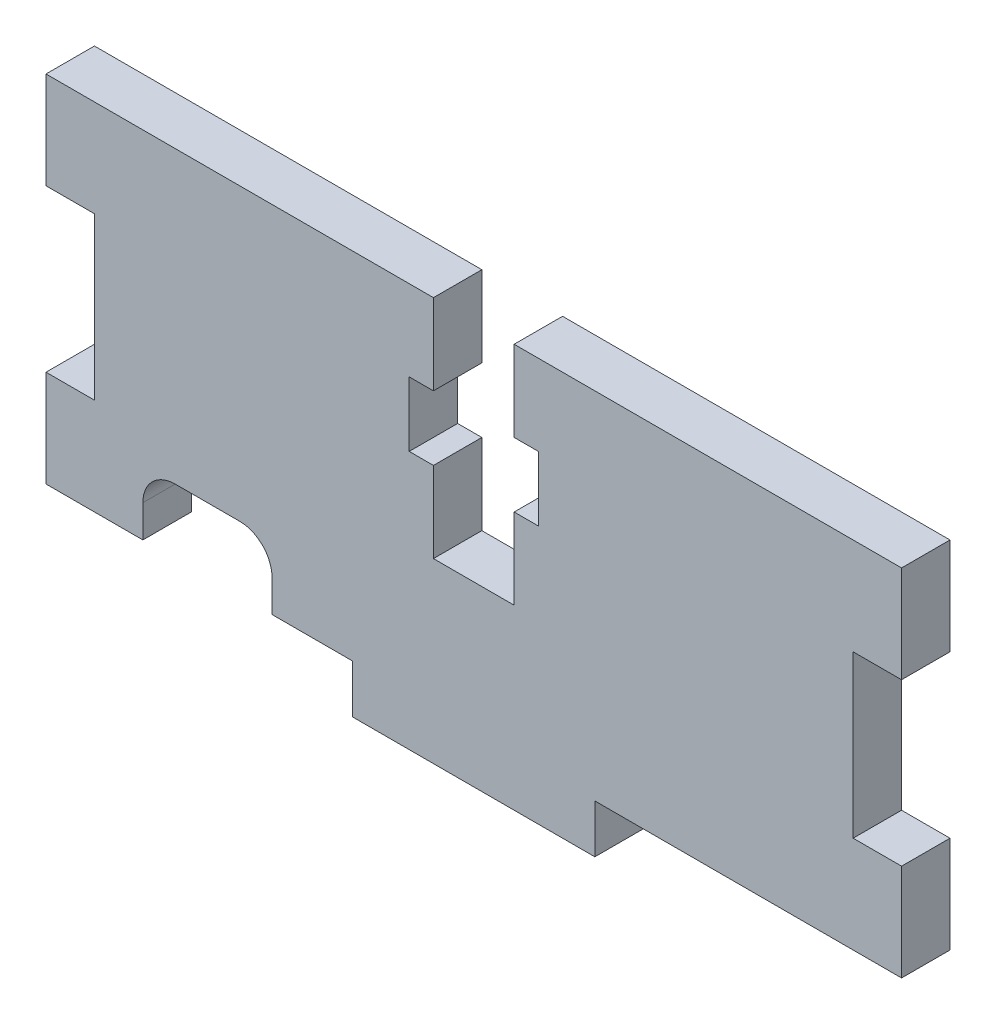
ISO-10303-21;
HEADER;
FILE_DESCRIPTION(('STEP AP214'),'2;1');
FILE_NAME('part.step','',(''),(''),'','','');
FILE_SCHEMA(('AUTOMOTIVE_DESIGN { 1 0 10303 214 1 1 1 1 }'));
ENDSEC;
DATA;
#1=APPLICATION_CONTEXT('core data for automotive mechanical design processes');
#2=APPLICATION_PROTOCOL_DEFINITION('international standard','automotive_design',2000,#1);
#3=PRODUCT_CONTEXT('',#1,'mechanical');
#4=PRODUCT('Part','Part','',(#3));
#5=PRODUCT_RELATED_PRODUCT_CATEGORY('part','',(#4));
#6=PRODUCT_DEFINITION_FORMATION('','',#4);
#7=PRODUCT_DEFINITION_CONTEXT('part definition',#1,'design');
#8=PRODUCT_DEFINITION('design','',#6,#7);
#9=PRODUCT_DEFINITION_SHAPE('','',#8);
#10=(LENGTH_UNIT() NAMED_UNIT(*) SI_UNIT(.MILLI.,.METRE.));
#11=(NAMED_UNIT(*) PLANE_ANGLE_UNIT() SI_UNIT($,.RADIAN.));
#12=(NAMED_UNIT(*) SI_UNIT($,.STERADIAN.) SOLID_ANGLE_UNIT());
#13=UNCERTAINTY_MEASURE_WITH_UNIT(LENGTH_MEASURE(1.E-05),#10,'distance_accuracy_value','');
#14=(GEOMETRIC_REPRESENTATION_CONTEXT(3) GLOBAL_UNCERTAINTY_ASSIGNED_CONTEXT((#13)) GLOBAL_UNIT_ASSIGNED_CONTEXT((#10,
#11,#12)) REPRESENTATION_CONTEXT('',''));
#15=CARTESIAN_POINT('',(0.,0.,0.));
#16=DIRECTION('',(0.,0.,1.));
#17=DIRECTION('',(1.,0.,0.));
#18=AXIS2_PLACEMENT_3D('',#15,#16,#17);
#19=CARTESIAN_POINT('',(-54.,11.,1.5));
#20=DIRECTION('',(0.,1.,0.));
#21=DIRECTION('',(-1.,0.,0.));
#22=AXIS2_PLACEMENT_3D('',#19,#20,#21);
#23=PLANE('',#22);
#24=DIRECTION('',(0.,0.,1.));
#25=VECTOR('',#24,1.);
#26=CARTESIAN_POINT('',(30.,11.,-1.5));
#27=LINE('',#26,#25);
#28=CARTESIAN_POINT('',(30.,11.,-1.5));
#29=VERTEX_POINT('',#28);
#30=CARTESIAN_POINT('',(30.,11.,1.5));
#31=VERTEX_POINT('',#30);
#32=EDGE_CURVE('E431',#29,#31,#27,.T.);
#33=ORIENTED_EDGE('',*,*,#32,.T.);
#34=DIRECTION('',(1.,0.,0.));
#35=VECTOR('',#34,1.);
#36=CARTESIAN_POINT('',(-54.,11.,1.5));
#37=LINE('',#36,#35);
#38=CARTESIAN_POINT('',(54.,11.,1.5));
#39=VERTEX_POINT('',#38);
#40=EDGE_CURVE('E396',#31,#39,#37,.T.);
#41=ORIENTED_EDGE('',*,*,#40,.T.);
#42=DIRECTION('',(0.,0.,-1.));
#43=VECTOR('',#42,1.);
#44=CARTESIAN_POINT('',(54.,11.,1.5));
#45=LINE('',#44,#43);
#46=CARTESIAN_POINT('',(54.,11.,-1.5));
#47=VERTEX_POINT('',#46);
#48=EDGE_CURVE('E289',#39,#47,#45,.T.);
#49=ORIENTED_EDGE('',*,*,#48,.T.);
#50=DIRECTION('',(1.,0.,0.));
#51=VECTOR('',#50,1.);
#52=CARTESIAN_POINT('',(-54.,11.,-1.5));
#53=LINE('',#52,#51);
#54=EDGE_CURVE('E281',#29,#47,#53,.T.);
#55=ORIENTED_EDGE('',*,*,#54,.F.);
#56=EDGE_LOOP('',(#33,#41,#49,#55));
#57=FACE_BOUND('',#56,.T.);
#58=ADVANCED_FACE('F33',(#57),#23,.T.);
#59=CARTESIAN_POINT('',(-20.,-11.,1.5));
#60=DIRECTION('',(0.,1.,0.));
#61=DIRECTION('',(-1.,0.,0.));
#62=AXIS2_PLACEMENT_3D('',#59,#60,#61);
#63=PLANE('',#62);
#64=DIRECTION('',(1.,0.,0.));
#65=VECTOR('',#64,1.);
#66=CARTESIAN_POINT('',(-20.,-11.,1.5));
#67=LINE('',#66,#65);
#68=CARTESIAN_POINT('',(15.,-11.,1.5));
#69=VERTEX_POINT('',#68);
#70=CARTESIAN_POINT('',(20.,-11.,1.5));
#71=VERTEX_POINT('',#70);
#72=EDGE_CURVE('E280',#69,#71,#67,.T.);
#73=ORIENTED_EDGE('',*,*,#72,.F.);
#74=DIRECTION('',(0.,0.,-1.));
#75=VECTOR('',#74,1.);
#76=CARTESIAN_POINT('',(15.,-11.,1.5));
#77=LINE('',#76,#75);
#78=CARTESIAN_POINT('',(15.,-11.,-1.5));
#79=VERTEX_POINT('',#78);
#80=EDGE_CURVE('E406',#69,#79,#77,.T.);
#81=ORIENTED_EDGE('',*,*,#80,.T.);
#82=DIRECTION('',(1.,0.,0.));
#83=VECTOR('',#82,1.);
#84=CARTESIAN_POINT('',(-20.,-11.,-1.5));
#85=LINE('',#84,#83);
#86=CARTESIAN_POINT('',(20.,-11.,-1.5));
#87=VERTEX_POINT('',#86);
#88=EDGE_CURVE('E377',#79,#87,#85,.T.);
#89=ORIENTED_EDGE('',*,*,#88,.T.);
#90=DIRECTION('',(0.,0.,-1.));
#91=VECTOR('',#90,1.);
#92=CARTESIAN_POINT('',(20.,-11.,1.5));
#93=LINE('',#92,#91);
#94=EDGE_CURVE('E11',#71,#87,#93,.T.);
#95=ORIENTED_EDGE('',*,*,#94,.F.);
#96=EDGE_LOOP('',(#73,#81,#89,#95));
#97=FACE_BOUND('',#96,.T.);
#98=ADVANCED_FACE('F405',(#97),#63,.F.);
#99=CARTESIAN_POINT('',(54.,11.,1.5));
#100=DIRECTION('',(1.,0.,0.));
#101=DIRECTION('',(0.,0.,-1.));
#102=AXIS2_PLACEMENT_3D('',#99,#100,#101);
#103=PLANE('',#102);
#104=DIRECTION('',(0.,0.,1.));
#105=VECTOR('',#104,1.);
#106=CARTESIAN_POINT('',(54.,5.,-1.5));
#107=LINE('',#106,#105);
#108=CARTESIAN_POINT('',(54.,5.,-1.5));
#109=VERTEX_POINT('',#108);
#110=CARTESIAN_POINT('',(54.,5.,1.5));
#111=VERTEX_POINT('',#110);
#112=EDGE_CURVE('E342',#109,#111,#107,.T.);
#113=ORIENTED_EDGE('',*,*,#112,.F.);
#114=DIRECTION('',(0.,-1.,0.));
#115=VECTOR('',#114,1.);
#116=CARTESIAN_POINT('',(54.,11.,-1.5));
#117=LINE('',#116,#115);
#118=EDGE_CURVE('E285',#47,#109,#117,.T.);
#119=ORIENTED_EDGE('',*,*,#118,.F.);
#120=ORIENTED_EDGE('',*,*,#48,.F.);
#121=DIRECTION('',(0.,-1.,0.));
#122=VECTOR('',#121,1.);
#123=CARTESIAN_POINT('',(54.,11.,1.5));
#124=LINE('',#123,#122);
#125=EDGE_CURVE('E343',#39,#111,#124,.T.);
#126=ORIENTED_EDGE('',*,*,#125,.T.);
#127=EDGE_LOOP('',(#113,#119,#120,#126));
#128=FACE_BOUND('',#127,.T.);
#129=ADVANCED_FACE('F339',(#128),#103,.T.);
#130=CARTESIAN_POINT('',(1.00000000000002,-11.,-1.5));
#131=VERTEX_POINT('',#130);
#132=CARTESIAN_POINT('',(7.,-11.,-1.5));
#133=VERTEX_POINT('',#132);
#134=EDGE_CURVE('E320',#131,#133,#85,.T.);
#135=ORIENTED_EDGE('',*,*,#134,.T.);
#136=DIRECTION('',(0.,0.,-1.));
#137=VECTOR('',#136,1.);
#138=CARTESIAN_POINT('',(7.,-11.,1.5));
#139=LINE('',#138,#137);
#140=CARTESIAN_POINT('',(7.,-11.,1.5));
#141=VERTEX_POINT('',#140);
#142=EDGE_CURVE('E56',#141,#133,#139,.T.);
#143=ORIENTED_EDGE('',*,*,#142,.F.);
#144=CARTESIAN_POINT('',(1.00000000000002,-11.,1.5));
#145=VERTEX_POINT('',#144);
#146=EDGE_CURVE('E283',#145,#141,#67,.T.);
#147=ORIENTED_EDGE('',*,*,#146,.F.);
#148=DIRECTION('',(0.,0.,-1.));
#149=VECTOR('',#148,1.);
#150=CARTESIAN_POINT('',(1.00000000000002,-11.,1.5));
#151=LINE('',#150,#149);
#152=EDGE_CURVE('E458',#145,#131,#151,.T.);
#153=ORIENTED_EDGE('',*,*,#152,.T.);
#154=EDGE_LOOP('',(#135,#143,#147,#153));
#155=FACE_BOUND('',#154,.T.);
#156=ADVANCED_FACE('F35',(#155),#63,.F.);
#157=CARTESIAN_POINT('',(20.,-11.,1.5));
#158=DIRECTION('',(1.,0.,0.));
#159=DIRECTION('',(0.,1.,0.));
#160=AXIS2_PLACEMENT_3D('',#157,#158,#159);
#161=PLANE('',#160);
#162=DIRECTION('',(0.,-1.,0.));
#163=VECTOR('',#162,1.);
#164=CARTESIAN_POINT('',(20.,-11.,-1.5));
#165=LINE('',#164,#163);
#166=CARTESIAN_POINT('',(20.,-14.,-1.5));
#167=VERTEX_POINT('',#166);
#168=EDGE_CURVE('E313',#87,#167,#165,.T.);
#169=ORIENTED_EDGE('',*,*,#168,.T.);
#170=DIRECTION('',(0.,0.,-1.));
#171=VECTOR('',#170,1.);
#172=CARTESIAN_POINT('',(20.,-14.,1.5));
#173=LINE('',#172,#171);
#174=CARTESIAN_POINT('',(20.,-14.,1.5));
#175=VERTEX_POINT('',#174);
#176=EDGE_CURVE('E41',#175,#167,#173,.T.);
#177=ORIENTED_EDGE('',*,*,#176,.F.);
#178=DIRECTION('',(0.,-1.,0.));
#179=VECTOR('',#178,1.);
#180=CARTESIAN_POINT('',(20.,-11.,1.5));
#181=LINE('',#180,#179);
#182=EDGE_CURVE('E385',#71,#175,#181,.T.);
#183=ORIENTED_EDGE('',*,*,#182,.F.);
#184=ORIENTED_EDGE('',*,*,#94,.T.);
#185=EDGE_LOOP('',(#169,#177,#183,#184));
#186=FACE_BOUND('',#185,.T.);
#187=ADVANCED_FACE('F408',(#186),#161,.F.);
#188=CARTESIAN_POINT('',(20.,-14.,1.5));
#189=DIRECTION('',(0.,1.,0.));
#190=DIRECTION('',(-1.,0.,0.));
#191=AXIS2_PLACEMENT_3D('',#188,#189,#190);
#192=PLANE('',#191);
#193=DIRECTION('',(1.,0.,0.));
#194=VECTOR('',#193,1.);
#195=CARTESIAN_POINT('',(20.,-14.,-1.5));
#196=LINE('',#195,#194);
#197=CARTESIAN_POINT('',(35.,-14.,-1.5));
#198=VERTEX_POINT('',#197);
#199=EDGE_CURVE('E306',#167,#198,#196,.T.);
#200=ORIENTED_EDGE('',*,*,#199,.T.);
#201=DIRECTION('',(0.,0.,-1.));
#202=VECTOR('',#201,1.);
#203=CARTESIAN_POINT('',(35.,-14.,1.5));
#204=LINE('',#203,#202);
#205=CARTESIAN_POINT('',(35.,-14.,1.5));
#206=VERTEX_POINT('',#205);
#207=EDGE_CURVE('E297',#206,#198,#204,.T.);
#208=ORIENTED_EDGE('',*,*,#207,.F.);
#209=DIRECTION('',(1.,0.,0.));
#210=VECTOR('',#209,1.);
#211=CARTESIAN_POINT('',(20.,-14.,1.5));
#212=LINE('',#211,#210);
#213=EDGE_CURVE('E308',#175,#206,#212,.T.);
#214=ORIENTED_EDGE('',*,*,#213,.F.);
#215=ORIENTED_EDGE('',*,*,#176,.T.);
#216=EDGE_LOOP('',(#200,#208,#214,#215));
#217=FACE_BOUND('',#216,.T.);
#218=ADVANCED_FACE('F304',(#217),#192,.F.);
#219=CARTESIAN_POINT('',(35.,-11.,1.5));
#220=DIRECTION('',(1.,0.,0.));
#221=DIRECTION('',(0.,0.,-1.));
#222=AXIS2_PLACEMENT_3D('',#219,#220,#221);
#223=PLANE('',#222);
#224=DIRECTION('',(0.,-1.,0.));
#225=VECTOR('',#224,1.);
#226=CARTESIAN_POINT('',(35.,-11.,-1.5));
#227=LINE('',#226,#225);
#228=CARTESIAN_POINT('',(35.,-11.,-1.5));
#229=VERTEX_POINT('',#228);
#230=EDGE_CURVE('E316',#229,#198,#227,.T.);
#231=ORIENTED_EDGE('',*,*,#230,.F.);
#232=DIRECTION('',(0.,0.,-1.));
#233=VECTOR('',#232,1.);
#234=CARTESIAN_POINT('',(35.,-11.,1.5));
#235=LINE('',#234,#233);
#236=CARTESIAN_POINT('',(35.,-11.,1.5));
#237=VERTEX_POINT('',#236);
#238=EDGE_CURVE('E295',#237,#229,#235,.T.);
#239=ORIENTED_EDGE('',*,*,#238,.F.);
#240=DIRECTION('',(0.,-1.,0.));
#241=VECTOR('',#240,1.);
#242=CARTESIAN_POINT('',(35.,-11.,1.5));
#243=LINE('',#242,#241);
#244=EDGE_CURVE('E388',#237,#206,#243,.T.);
#245=ORIENTED_EDGE('',*,*,#244,.T.);
#246=ORIENTED_EDGE('',*,*,#207,.T.);
#247=EDGE_LOOP('',(#231,#239,#245,#246));
#248=FACE_BOUND('',#247,.T.);
#249=ADVANCED_FACE('F484',(#248),#223,.T.);
#250=CARTESIAN_POINT('',(35.,-11.,1.5));
#251=DIRECTION('',(0.,1.,0.));
#252=DIRECTION('',(-1.,0.,0.));
#253=AXIS2_PLACEMENT_3D('',#250,#251,#252);
#254=PLANE('',#253);
#255=DIRECTION('',(1.,0.,0.));
#256=VECTOR('',#255,1.);
#257=CARTESIAN_POINT('',(35.,-11.,-1.5));
#258=LINE('',#257,#256);
#259=CARTESIAN_POINT('',(54.,-11.,-1.5));
#260=VERTEX_POINT('',#259);
#261=EDGE_CURVE('E318',#229,#260,#258,.T.);
#262=ORIENTED_EDGE('',*,*,#261,.T.);
#263=DIRECTION('',(0.,0.,-1.));
#264=VECTOR('',#263,1.);
#265=CARTESIAN_POINT('',(54.,-11.,1.5));
#266=LINE('',#265,#264);
#267=CARTESIAN_POINT('',(54.,-11.,1.5));
#268=VERTEX_POINT('',#267);
#269=EDGE_CURVE('E292',#268,#260,#266,.T.);
#270=ORIENTED_EDGE('',*,*,#269,.F.);
#271=DIRECTION('',(1.,0.,0.));
#272=VECTOR('',#271,1.);
#273=CARTESIAN_POINT('',(35.,-11.,1.5));
#274=LINE('',#273,#272);
#275=EDGE_CURVE('E391',#237,#268,#274,.T.);
#276=ORIENTED_EDGE('',*,*,#275,.F.);
#277=ORIENTED_EDGE('',*,*,#238,.T.);
#278=EDGE_LOOP('',(#262,#270,#276,#277));
#279=FACE_BOUND('',#278,.T.);
#280=ADVANCED_FACE('F482',(#279),#254,.F.);
#281=DIRECTION('',(0.,0.,1.));
#282=VECTOR('',#281,1.);
#283=CARTESIAN_POINT('',(54.,-5.,-1.5));
#284=LINE('',#283,#282);
#285=CARTESIAN_POINT('',(54.,-5.,-1.5));
#286=VERTEX_POINT('',#285);
#287=CARTESIAN_POINT('',(54.,-5.,1.5));
#288=VERTEX_POINT('',#287);
#289=EDGE_CURVE('E348',#286,#288,#284,.T.);
#290=ORIENTED_EDGE('',*,*,#289,.T.);
#291=EDGE_CURVE('E394',#288,#268,#124,.T.);
#292=ORIENTED_EDGE('',*,*,#291,.T.);
#293=ORIENTED_EDGE('',*,*,#269,.T.);
#294=EDGE_CURVE('E324',#286,#260,#117,.T.);
#295=ORIENTED_EDGE('',*,*,#294,.F.);
#296=EDGE_LOOP('',(#290,#292,#293,#295));
#297=FACE_BOUND('',#296,.T.);
#298=ADVANCED_FACE('F480',(#297),#103,.T.);
#299=DIRECTION('',(0.,0.,1.));
#300=VECTOR('',#299,1.);
#301=CARTESIAN_POINT('',(25.,11.,-1.5));
#302=LINE('',#301,#300);
#303=CARTESIAN_POINT('',(25.,11.,-1.5));
#304=VERTEX_POINT('',#303);
#305=CARTESIAN_POINT('',(25.,11.,1.5));
#306=VERTEX_POINT('',#305);
#307=EDGE_CURVE('E258',#304,#306,#302,.T.);
#308=ORIENTED_EDGE('',*,*,#307,.F.);
#309=CARTESIAN_POINT('',(1.00000000000002,11.,-1.5));
#310=VERTEX_POINT('',#309);
#311=EDGE_CURVE('E270',#310,#304,#53,.T.);
#312=ORIENTED_EDGE('',*,*,#311,.F.);
#313=DIRECTION('',(0.,0.,1.));
#314=VECTOR('',#313,1.);
#315=CARTESIAN_POINT('',(1.00000000000002,11.,-1.5));
#316=LINE('',#315,#314);
#317=CARTESIAN_POINT('',(1.00000000000002,11.,1.5));
#318=VERTEX_POINT('',#317);
#319=EDGE_CURVE('E456',#310,#318,#316,.T.);
#320=ORIENTED_EDGE('',*,*,#319,.T.);
#321=EDGE_CURVE('E272',#318,#306,#37,.T.);
#322=ORIENTED_EDGE('',*,*,#321,.T.);
#323=EDGE_LOOP('',(#308,#312,#320,#322));
#324=FACE_BOUND('',#323,.T.);
#325=ADVANCED_FACE('F268',(#324),#23,.T.);
#326=CARTESIAN_POINT('',(0.,0.,1.5));
#327=DIRECTION('',(0.,0.,1.));
#328=DIRECTION('',(1.,0.,0.));
#329=AXIS2_PLACEMENT_3D('',#326,#327,#328);
#330=PLANE('',#329);
#331=DIRECTION('',(0.,1.,0.));
#332=VECTOR('',#331,1.);
#333=CARTESIAN_POINT('',(30.,6.00000000000002,1.5));
#334=LINE('',#333,#332);
#335=CARTESIAN_POINT('',(30.,6.00000000000002,1.5));
#336=VERTEX_POINT('',#335);
#337=EDGE_CURVE('E263',#336,#31,#334,.T.);
#338=ORIENTED_EDGE('',*,*,#337,.F.);
#339=DIRECTION('',(-1.,0.,0.));
#340=VECTOR('',#339,1.);
#341=CARTESIAN_POINT('',(31.5,6.00000000000002,1.5));
#342=LINE('',#341,#340);
#343=CARTESIAN_POINT('',(31.5,6.00000000000002,1.5));
#344=VERTEX_POINT('',#343);
#345=EDGE_CURVE('E838',#344,#336,#342,.T.);
#346=ORIENTED_EDGE('',*,*,#345,.F.);
#347=DIRECTION('',(0.,1.,0.));
#348=VECTOR('',#347,1.);
#349=CARTESIAN_POINT('',(31.5,2.00000000000002,1.5));
#350=LINE('',#349,#348);
#351=CARTESIAN_POINT('',(31.5,2.00000000000002,1.5));
#352=VERTEX_POINT('',#351);
#353=EDGE_CURVE('E835',#352,#344,#350,.T.);
#354=ORIENTED_EDGE('',*,*,#353,.F.);
#355=DIRECTION('',(1.,0.,0.));
#356=VECTOR('',#355,1.);
#357=CARTESIAN_POINT('',(30.,2.00000000000002,1.5));
#358=LINE('',#357,#356);
#359=CARTESIAN_POINT('',(30.,2.00000000000002,1.5));
#360=VERTEX_POINT('',#359);
#361=EDGE_CURVE('E832',#360,#352,#358,.T.);
#362=ORIENTED_EDGE('',*,*,#361,.F.);
#363=DIRECTION('',(0.,1.,0.));
#364=VECTOR('',#363,1.);
#365=CARTESIAN_POINT('',(30.,-2.99999999999998,1.5));
#366=LINE('',#365,#364);
#367=CARTESIAN_POINT('',(30.,-2.99999999999998,1.5));
#368=VERTEX_POINT('',#367);
#369=EDGE_CURVE('E829',#368,#360,#366,.T.);
#370=ORIENTED_EDGE('',*,*,#369,.F.);
#371=DIRECTION('',(1.,0.,0.));
#372=VECTOR('',#371,1.);
#373=CARTESIAN_POINT('',(25.,-2.99999999999998,1.5));
#374=LINE('',#373,#372);
#375=CARTESIAN_POINT('',(25.,-2.99999999999998,1.5));
#376=VERTEX_POINT('',#375);
#377=EDGE_CURVE('E826',#376,#368,#374,.T.);
#378=ORIENTED_EDGE('',*,*,#377,.F.);
#379=DIRECTION('',(0.,-1.,0.));
#380=VECTOR('',#379,1.);
#381=CARTESIAN_POINT('',(25.,2.00000000000002,1.5));
#382=LINE('',#381,#380);
#383=CARTESIAN_POINT('',(25.,2.00000000000002,1.5));
#384=VERTEX_POINT('',#383);
#385=EDGE_CURVE('E820',#384,#376,#382,.T.);
#386=ORIENTED_EDGE('',*,*,#385,.F.);
#387=DIRECTION('',(1.,0.,0.));
#388=VECTOR('',#387,1.);
#389=CARTESIAN_POINT('',(23.5,2.00000000000002,1.5));
#390=LINE('',#389,#388);
#391=CARTESIAN_POINT('',(23.5,2.00000000000002,1.5));
#392=VERTEX_POINT('',#391);
#393=EDGE_CURVE('E818',#392,#384,#390,.T.);
#394=ORIENTED_EDGE('',*,*,#393,.F.);
#395=DIRECTION('',(0.,-1.,0.));
#396=VECTOR('',#395,1.);
#397=CARTESIAN_POINT('',(23.5,6.00000000000002,1.5));
#398=LINE('',#397,#396);
#399=CARTESIAN_POINT('',(23.5,6.00000000000002,1.5));
#400=VERTEX_POINT('',#399);
#401=EDGE_CURVE('E811',#400,#392,#398,.T.);
#402=ORIENTED_EDGE('',*,*,#401,.F.);
#403=DIRECTION('',(-1.,0.,0.));
#404=VECTOR('',#403,1.);
#405=CARTESIAN_POINT('',(25.,6.00000000000002,1.5));
#406=LINE('',#405,#404);
#407=CARTESIAN_POINT('',(25.,6.00000000000002,1.5));
#408=VERTEX_POINT('',#407);
#409=EDGE_CURVE('E807',#408,#400,#406,.T.);
#410=ORIENTED_EDGE('',*,*,#409,.F.);
#411=DIRECTION('',(0.,-1.,0.));
#412=VECTOR('',#411,1.);
#413=CARTESIAN_POINT('',(25.,11.,1.5));
#414=LINE('',#413,#412);
#415=EDGE_CURVE('E812',#306,#408,#414,.T.);
#416=ORIENTED_EDGE('',*,*,#415,.F.);
#417=ORIENTED_EDGE('',*,*,#321,.F.);
#418=DIRECTION('',(0.,1.,0.));
#419=VECTOR('',#418,1.);
#420=CARTESIAN_POINT('',(1.00000000000002,11.,1.5));
#421=LINE('',#420,#419);
#422=CARTESIAN_POINT('',(1.00000000000002,5.,1.5));
#423=VERTEX_POINT('',#422);
#424=EDGE_CURVE('E444',#423,#318,#421,.T.);
#425=ORIENTED_EDGE('',*,*,#424,.F.);
#426=DIRECTION('',(-1.,0.,0.));
#427=VECTOR('',#426,1.);
#428=CARTESIAN_POINT('',(1.00000000000002,4.99999999999999,1.5));
#429=LINE('',#428,#427);
#430=CARTESIAN_POINT('',(4.00000000000002,4.99999999999999,1.5));
#431=VERTEX_POINT('',#430);
#432=EDGE_CURVE('E362',#431,#423,#429,.T.);
#433=ORIENTED_EDGE('',*,*,#432,.F.);
#434=DIRECTION('',(0.,1.,0.));
#435=VECTOR('',#434,1.);
#436=CARTESIAN_POINT('',(4.00000000000002,4.99999999999999,1.5));
#437=LINE('',#436,#435);
#438=CARTESIAN_POINT('',(4.00000000000002,-5.00000000000001,1.5));
#439=VERTEX_POINT('',#438);
#440=EDGE_CURVE('E370',#439,#431,#437,.T.);
#441=ORIENTED_EDGE('',*,*,#440,.F.);
#442=DIRECTION('',(1.,0.,0.));
#443=VECTOR('',#442,1.);
#444=CARTESIAN_POINT('',(1.00000000000003,-5.00000000000001,1.5));
#445=LINE('',#444,#443);
#446=CARTESIAN_POINT('',(1.00000000000003,-5.00000000000001,1.5));
#447=VERTEX_POINT('',#446);
#448=EDGE_CURVE('E350',#447,#439,#445,.T.);
#449=ORIENTED_EDGE('',*,*,#448,.F.);
#450=EDGE_CURVE('E454',#145,#447,#421,.T.);
#451=ORIENTED_EDGE('',*,*,#450,.F.);
#452=ORIENTED_EDGE('',*,*,#146,.T.);
#453=DIRECTION('',(0.,1.,0.));
#454=VECTOR('',#453,1.);
#455=CARTESIAN_POINT('',(7.,-11.,1.5));
#456=LINE('',#455,#454);
#457=CARTESIAN_POINT('',(7.,-8.99999999999998,1.5));
#458=VERTEX_POINT('',#457);
#459=EDGE_CURVE('E442',#141,#458,#456,.T.);
#460=ORIENTED_EDGE('',*,*,#459,.T.);
#461=CARTESIAN_POINT('',(9.,-8.99999999999998,1.5));
#462=DIRECTION('',(0.,0.,-1.));
#463=DIRECTION('',(1.,0.,0.));
#464=AXIS2_PLACEMENT_3D('',#461,#462,#463);
#465=CIRCLE('',#464,2.);
#466=CARTESIAN_POINT('',(9.,-6.99999999999998,1.5));
#467=VERTEX_POINT('',#466);
#468=EDGE_CURVE('E863',#458,#467,#465,.T.);
#469=ORIENTED_EDGE('',*,*,#468,.T.);
#470=DIRECTION('',(1.,0.,0.));
#471=VECTOR('',#470,1.);
#472=CARTESIAN_POINT('',(9.,-6.99999999999998,1.5));
#473=LINE('',#472,#471);
#474=CARTESIAN_POINT('',(13.,-6.99999999999998,1.5));
#475=VERTEX_POINT('',#474);
#476=EDGE_CURVE('E424',#467,#475,#473,.T.);
#477=ORIENTED_EDGE('',*,*,#476,.T.);
#478=CARTESIAN_POINT('',(13.,-8.99999999999998,1.5));
#479=DIRECTION('',(0.,0.,-1.));
#480=DIRECTION('',(1.,0.,0.));
#481=AXIS2_PLACEMENT_3D('',#478,#479,#480);
#482=CIRCLE('',#481,2.);
#483=CARTESIAN_POINT('',(15.,-8.99999999999998,1.5));
#484=VERTEX_POINT('',#483);
#485=EDGE_CURVE('E419',#475,#484,#482,.T.);
#486=ORIENTED_EDGE('',*,*,#485,.T.);
#487=DIRECTION('',(0.,-1.,0.));
#488=VECTOR('',#487,1.);
#489=CARTESIAN_POINT('',(15.,-8.99999999999998,1.5));
#490=LINE('',#489,#488);
#491=EDGE_CURVE('E416',#484,#69,#490,.T.);
#492=ORIENTED_EDGE('',*,*,#491,.T.);
#493=ORIENTED_EDGE('',*,*,#72,.T.);
#494=ORIENTED_EDGE('',*,*,#182,.T.);
#495=ORIENTED_EDGE('',*,*,#213,.T.);
#496=ORIENTED_EDGE('',*,*,#244,.F.);
#497=ORIENTED_EDGE('',*,*,#275,.T.);
#498=ORIENTED_EDGE('',*,*,#291,.F.);
#499=DIRECTION('',(1.,0.,0.));
#500=VECTOR('',#499,1.);
#501=CARTESIAN_POINT('',(51.,-5.00000000000001,1.5));
#502=LINE('',#501,#500);
#503=CARTESIAN_POINT('',(51.,-5.00000000000001,1.5));
#504=VERTEX_POINT('',#503);
#505=EDGE_CURVE('E469',#504,#288,#502,.T.);
#506=ORIENTED_EDGE('',*,*,#505,.F.);
#507=DIRECTION('',(0.,-1.,0.));
#508=VECTOR('',#507,1.);
#509=CARTESIAN_POINT('',(51.,4.99999999999999,1.5));
#510=LINE('',#509,#508);
#511=CARTESIAN_POINT('',(51.,4.99999999999999,1.5));
#512=VERTEX_POINT('',#511);
#513=EDGE_CURVE('E460',#512,#504,#510,.T.);
#514=ORIENTED_EDGE('',*,*,#513,.F.);
#515=DIRECTION('',(-1.,0.,0.));
#516=VECTOR('',#515,1.);
#517=CARTESIAN_POINT('',(51.,4.99999999999999,1.5));
#518=LINE('',#517,#516);
#519=EDGE_CURVE('E464',#111,#512,#518,.T.);
#520=ORIENTED_EDGE('',*,*,#519,.F.);
#521=ORIENTED_EDGE('',*,*,#125,.F.);
#522=ORIENTED_EDGE('',*,*,#40,.F.);
#523=EDGE_LOOP('',(#338,#346,#354,#362,#370,#378,#386,#394,#402,#410,#416,#417,#425,#433,#441,
#449,#451,#452,#460,#469,#477,#486,#492,#493,#494,#495,#496,#497,#498,#506,#514,#520,#521,#522));
#524=FACE_BOUND('',#523,.T.);
#525=ADVANCED_FACE('F411',(#524),#330,.T.);
#526=CARTESIAN_POINT('',(0.,0.,-1.5));
#527=DIRECTION('',(0.,0.,1.));
#528=DIRECTION('',(1.,0.,0.));
#529=AXIS2_PLACEMENT_3D('',#526,#527,#528);
#530=PLANE('',#529);
#531=DIRECTION('',(-1.,0.,0.));
#532=VECTOR('',#531,1.);
#533=CARTESIAN_POINT('',(31.5,6.00000000000002,-1.5));
#534=LINE('',#533,#532);
#535=CARTESIAN_POINT('',(31.5,6.00000000000002,-1.5));
#536=VERTEX_POINT('',#535);
#537=CARTESIAN_POINT('',(30.,6.00000000000002,-1.5));
#538=VERTEX_POINT('',#537);
#539=EDGE_CURVE('E883',#536,#538,#534,.T.);
#540=ORIENTED_EDGE('',*,*,#539,.T.);
#541=DIRECTION('',(0.,1.,0.));
#542=VECTOR('',#541,1.);
#543=CARTESIAN_POINT('',(30.,6.00000000000002,-1.5));
#544=LINE('',#543,#542);
#545=EDGE_CURVE('E273',#538,#29,#544,.T.);
#546=ORIENTED_EDGE('',*,*,#545,.T.);
#547=ORIENTED_EDGE('',*,*,#54,.T.);
#548=ORIENTED_EDGE('',*,*,#118,.T.);
#549=DIRECTION('',(-1.,0.,0.));
#550=VECTOR('',#549,1.);
#551=CARTESIAN_POINT('',(51.,4.99999999999999,-1.5));
#552=LINE('',#551,#550);
#553=CARTESIAN_POINT('',(51.,4.99999999999999,-1.5));
#554=VERTEX_POINT('',#553);
#555=EDGE_CURVE('E333',#109,#554,#552,.T.);
#556=ORIENTED_EDGE('',*,*,#555,.T.);
#557=DIRECTION('',(0.,-1.,0.));
#558=VECTOR('',#557,1.);
#559=CARTESIAN_POINT('',(51.,4.99999999999999,-1.5));
#560=LINE('',#559,#558);
#561=CARTESIAN_POINT('',(51.,-5.00000000000001,-1.5));
#562=VERTEX_POINT('',#561);
#563=EDGE_CURVE('E461',#554,#562,#560,.T.);
#564=ORIENTED_EDGE('',*,*,#563,.T.);
#565=DIRECTION('',(1.,0.,0.));
#566=VECTOR('',#565,1.);
#567=CARTESIAN_POINT('',(51.,-5.00000000000001,-1.5));
#568=LINE('',#567,#566);
#569=EDGE_CURVE('E463',#562,#286,#568,.T.);
#570=ORIENTED_EDGE('',*,*,#569,.T.);
#571=ORIENTED_EDGE('',*,*,#294,.T.);
#572=ORIENTED_EDGE('',*,*,#261,.F.);
#573=ORIENTED_EDGE('',*,*,#230,.T.);
#574=ORIENTED_EDGE('',*,*,#199,.F.);
#575=ORIENTED_EDGE('',*,*,#168,.F.);
#576=ORIENTED_EDGE('',*,*,#88,.F.);
#577=DIRECTION('',(0.,-1.,0.));
#578=VECTOR('',#577,1.);
#579=CARTESIAN_POINT('',(15.,-8.99999999999998,-1.5));
#580=LINE('',#579,#578);
#581=CARTESIAN_POINT('',(15.,-8.99999999999998,-1.5));
#582=VERTEX_POINT('',#581);
#583=EDGE_CURVE('E440',#582,#79,#580,.T.);
#584=ORIENTED_EDGE('',*,*,#583,.F.);
#585=CARTESIAN_POINT('',(13.,-8.99999999999998,-1.5));
#586=DIRECTION('',(0.,0.,-1.));
#587=DIRECTION('',(1.,0.,0.));
#588=AXIS2_PLACEMENT_3D('',#585,#586,#587);
#589=CIRCLE('',#588,2.);
#590=CARTESIAN_POINT('',(13.,-6.99999999999998,-1.5));
#591=VERTEX_POINT('',#590);
#592=EDGE_CURVE('E437',#591,#582,#589,.T.);
#593=ORIENTED_EDGE('',*,*,#592,.F.);
#594=DIRECTION('',(1.,0.,0.));
#595=VECTOR('',#594,1.);
#596=CARTESIAN_POINT('',(9.,-6.99999999999998,-1.5));
#597=LINE('',#596,#595);
#598=CARTESIAN_POINT('',(9.,-6.99999999999998,-1.5));
#599=VERTEX_POINT('',#598);
#600=EDGE_CURVE('E434',#599,#591,#597,.T.);
#601=ORIENTED_EDGE('',*,*,#600,.F.);
#602=CARTESIAN_POINT('',(9.,-8.99999999999998,-1.5));
#603=DIRECTION('',(0.,0.,-1.));
#604=DIRECTION('',(1.,0.,0.));
#605=AXIS2_PLACEMENT_3D('',#602,#603,#604);
#606=CIRCLE('',#605,2.);
#607=CARTESIAN_POINT('',(7.,-8.99999999999998,-1.5));
#608=VERTEX_POINT('',#607);
#609=EDGE_CURVE('E430',#608,#599,#606,.T.);
#610=ORIENTED_EDGE('',*,*,#609,.F.);
#611=DIRECTION('',(0.,1.,0.));
#612=VECTOR('',#611,1.);
#613=CARTESIAN_POINT('',(7.,-11.,-1.5));
#614=LINE('',#613,#612);
#615=EDGE_CURVE('E428',#133,#608,#614,.T.);
#616=ORIENTED_EDGE('',*,*,#615,.F.);
#617=ORIENTED_EDGE('',*,*,#134,.F.);
#618=DIRECTION('',(0.,1.,0.));
#619=VECTOR('',#618,1.);
#620=CARTESIAN_POINT('',(1.00000000000002,11.,-1.5));
#621=LINE('',#620,#619);
#622=CARTESIAN_POINT('',(1.00000000000002,-5.,-1.5));
#623=VERTEX_POINT('',#622);
#624=EDGE_CURVE('E453',#131,#623,#621,.T.);
#625=ORIENTED_EDGE('',*,*,#624,.T.);
#626=DIRECTION('',(1.,0.,0.));
#627=VECTOR('',#626,1.);
#628=CARTESIAN_POINT('',(1.00000000000003,-5.00000000000001,-1.5));
#629=LINE('',#628,#627);
#630=CARTESIAN_POINT('',(4.00000000000002,-5.00000000000001,-1.5));
#631=VERTEX_POINT('',#630);
#632=EDGE_CURVE('E358',#623,#631,#629,.T.);
#633=ORIENTED_EDGE('',*,*,#632,.T.);
#634=DIRECTION('',(0.,1.,0.));
#635=VECTOR('',#634,1.);
#636=CARTESIAN_POINT('',(4.00000000000002,4.99999999999999,-1.5));
#637=LINE('',#636,#635);
#638=CARTESIAN_POINT('',(4.00000000000002,4.99999999999999,-1.5));
#639=VERTEX_POINT('',#638);
#640=EDGE_CURVE('E361',#631,#639,#637,.T.);
#641=ORIENTED_EDGE('',*,*,#640,.T.);
#642=DIRECTION('',(-1.,0.,0.));
#643=VECTOR('',#642,1.);
#644=CARTESIAN_POINT('',(1.00000000000002,4.99999999999999,-1.5));
#645=LINE('',#644,#643);
#646=CARTESIAN_POINT('',(1.00000000000002,4.99999999999999,-1.5));
#647=VERTEX_POINT('',#646);
#648=EDGE_CURVE('E365',#639,#647,#645,.T.);
#649=ORIENTED_EDGE('',*,*,#648,.T.);
#650=EDGE_CURVE('E279',#647,#310,#621,.T.);
#651=ORIENTED_EDGE('',*,*,#650,.T.);
#652=ORIENTED_EDGE('',*,*,#311,.T.);
#653=DIRECTION('',(0.,-1.,0.));
#654=VECTOR('',#653,1.);
#655=CARTESIAN_POINT('',(25.,11.,-1.5));
#656=LINE('',#655,#654);
#657=CARTESIAN_POINT('',(25.,6.00000000000002,-1.5));
#658=VERTEX_POINT('',#657);
#659=EDGE_CURVE('E254',#304,#658,#656,.T.);
#660=ORIENTED_EDGE('',*,*,#659,.T.);
#661=DIRECTION('',(-1.,0.,0.));
#662=VECTOR('',#661,1.);
#663=CARTESIAN_POINT('',(25.,6.00000000000002,-1.5));
#664=LINE('',#663,#662);
#665=CARTESIAN_POINT('',(23.5,6.00000000000002,-1.5));
#666=VERTEX_POINT('',#665);
#667=EDGE_CURVE('E48',#658,#666,#664,.T.);
#668=ORIENTED_EDGE('',*,*,#667,.T.);
#669=DIRECTION('',(0.,-1.,0.));
#670=VECTOR('',#669,1.);
#671=CARTESIAN_POINT('',(23.5,6.00000000000002,-1.5));
#672=LINE('',#671,#670);
#673=CARTESIAN_POINT('',(23.5,2.00000000000002,-1.5));
#674=VERTEX_POINT('',#673);
#675=EDGE_CURVE('E903',#666,#674,#672,.T.);
#676=ORIENTED_EDGE('',*,*,#675,.T.);
#677=DIRECTION('',(1.,0.,0.));
#678=VECTOR('',#677,1.);
#679=CARTESIAN_POINT('',(23.5,2.00000000000002,-1.5));
#680=LINE('',#679,#678);
#681=CARTESIAN_POINT('',(25.,2.00000000000002,-1.5));
#682=VERTEX_POINT('',#681);
#683=EDGE_CURVE('E900',#674,#682,#680,.T.);
#684=ORIENTED_EDGE('',*,*,#683,.T.);
#685=DIRECTION('',(0.,-1.,0.));
#686=VECTOR('',#685,1.);
#687=CARTESIAN_POINT('',(25.,2.00000000000002,-1.5));
#688=LINE('',#687,#686);
#689=CARTESIAN_POINT('',(25.,-2.99999999999998,-1.5));
#690=VERTEX_POINT('',#689);
#691=EDGE_CURVE('E897',#682,#690,#688,.T.);
#692=ORIENTED_EDGE('',*,*,#691,.T.);
#693=DIRECTION('',(1.,0.,0.));
#694=VECTOR('',#693,1.);
#695=CARTESIAN_POINT('',(25.,-2.99999999999998,-1.5));
#696=LINE('',#695,#694);
#697=CARTESIAN_POINT('',(30.,-2.99999999999998,-1.5));
#698=VERTEX_POINT('',#697);
#699=EDGE_CURVE('E894',#690,#698,#696,.T.);
#700=ORIENTED_EDGE('',*,*,#699,.T.);
#701=DIRECTION('',(0.,1.,0.));
#702=VECTOR('',#701,1.);
#703=CARTESIAN_POINT('',(30.,-2.99999999999998,-1.5));
#704=LINE('',#703,#702);
#705=CARTESIAN_POINT('',(30.,2.00000000000002,-1.5));
#706=VERTEX_POINT('',#705);
#707=EDGE_CURVE('E891',#698,#706,#704,.T.);
#708=ORIENTED_EDGE('',*,*,#707,.T.);
#709=DIRECTION('',(1.,0.,0.));
#710=VECTOR('',#709,1.);
#711=CARTESIAN_POINT('',(30.,2.00000000000002,-1.5));
#712=LINE('',#711,#710);
#713=CARTESIAN_POINT('',(31.5,2.00000000000002,-1.5));
#714=VERTEX_POINT('',#713);
#715=EDGE_CURVE('E888',#706,#714,#712,.T.);
#716=ORIENTED_EDGE('',*,*,#715,.T.);
#717=DIRECTION('',(0.,1.,0.));
#718=VECTOR('',#717,1.);
#719=CARTESIAN_POINT('',(31.5,2.00000000000002,-1.5));
#720=LINE('',#719,#718);
#721=EDGE_CURVE('E885',#714,#536,#720,.T.);
#722=ORIENTED_EDGE('',*,*,#721,.T.);
#723=EDGE_LOOP('',(#540,#546,#547,#548,#556,#564,#570,#571,#572,#573,#574,#575,#576,#584,#593,
#601,#610,#616,#617,#625,#633,#641,#649,#651,#652,#660,#668,#676,#684,#692,#700,#708,#716,#722));
#724=FACE_BOUND('',#723,.T.);
#725=ADVANCED_FACE('F277',(#724),#530,.F.);
#726=CARTESIAN_POINT('',(1.00000000000002,4.99999999999999,-1.5));
#727=DIRECTION('',(0.,1.,0.));
#728=DIRECTION('',(0.,0.,1.));
#729=AXIS2_PLACEMENT_3D('',#726,#727,#728);
#730=PLANE('',#729);
#731=ORIENTED_EDGE('',*,*,#432,.T.);
#732=DIRECTION('',(0.,0.,1.));
#733=VECTOR('',#732,1.);
#734=CARTESIAN_POINT('',(1.00000000000002,4.99999999999999,-1.5));
#735=LINE('',#734,#733);
#736=EDGE_CURVE('E375',#647,#423,#735,.T.);
#737=ORIENTED_EDGE('',*,*,#736,.F.);
#738=ORIENTED_EDGE('',*,*,#648,.F.);
#739=DIRECTION('',(0.,0.,1.));
#740=VECTOR('',#739,1.);
#741=CARTESIAN_POINT('',(4.00000000000002,4.99999999999999,-1.5));
#742=LINE('',#741,#740);
#743=EDGE_CURVE('E378',#639,#431,#742,.T.);
#744=ORIENTED_EDGE('',*,*,#743,.T.);
#745=EDGE_LOOP('',(#731,#737,#738,#744));
#746=FACE_BOUND('',#745,.T.);
#747=ADVANCED_FACE('F555',(#746),#730,.F.);
#748=CARTESIAN_POINT('',(4.00000000000002,4.99999999999999,-1.5));
#749=DIRECTION('',(1.,0.,0.));
#750=DIRECTION('',(0.,0.,-1.));
#751=AXIS2_PLACEMENT_3D('',#748,#749,#750);
#752=PLANE('',#751);
#753=ORIENTED_EDGE('',*,*,#440,.T.);
#754=ORIENTED_EDGE('',*,*,#743,.F.);
#755=ORIENTED_EDGE('',*,*,#640,.F.);
#756=DIRECTION('',(0.,0.,1.));
#757=VECTOR('',#756,1.);
#758=CARTESIAN_POINT('',(4.00000000000002,-5.00000000000001,-1.5));
#759=LINE('',#758,#757);
#760=EDGE_CURVE('E380',#631,#439,#759,.T.);
#761=ORIENTED_EDGE('',*,*,#760,.T.);
#762=EDGE_LOOP('',(#753,#754,#755,#761));
#763=FACE_BOUND('',#762,.T.);
#764=ADVANCED_FACE('F549',(#763),#752,.F.);
#765=CARTESIAN_POINT('',(1.00000000000003,-5.00000000000001,-1.5));
#766=DIRECTION('',(0.,-1.,0.));
#767=DIRECTION('',(0.,0.,-1.));
#768=AXIS2_PLACEMENT_3D('',#765,#766,#767);
#769=PLANE('',#768);
#770=ORIENTED_EDGE('',*,*,#448,.T.);
#771=ORIENTED_EDGE('',*,*,#760,.F.);
#772=ORIENTED_EDGE('',*,*,#632,.F.);
#773=DIRECTION('',(0.,0.,1.));
#774=VECTOR('',#773,1.);
#775=CARTESIAN_POINT('',(1.00000000000003,-5.00000000000001,-1.5));
#776=LINE('',#775,#774);
#777=EDGE_CURVE('E367',#623,#447,#776,.T.);
#778=ORIENTED_EDGE('',*,*,#777,.T.);
#779=EDGE_LOOP('',(#770,#771,#772,#778));
#780=FACE_BOUND('',#779,.T.);
#781=ADVANCED_FACE('F554',(#780),#769,.F.);
#782=CARTESIAN_POINT('',(51.,4.99999999999999,-1.5));
#783=DIRECTION('',(-1.,0.,0.));
#784=DIRECTION('',(0.,0.,1.));
#785=AXIS2_PLACEMENT_3D('',#782,#783,#784);
#786=PLANE('',#785);
#787=ORIENTED_EDGE('',*,*,#513,.T.);
#788=DIRECTION('',(0.,0.,1.));
#789=VECTOR('',#788,1.);
#790=CARTESIAN_POINT('',(51.,-5.00000000000001,-1.5));
#791=LINE('',#790,#789);
#792=EDGE_CURVE('E353',#562,#504,#791,.T.);
#793=ORIENTED_EDGE('',*,*,#792,.F.);
#794=ORIENTED_EDGE('',*,*,#563,.F.);
#795=DIRECTION('',(0.,0.,1.));
#796=VECTOR('',#795,1.);
#797=CARTESIAN_POINT('',(51.,4.99999999999999,-1.5));
#798=LINE('',#797,#796);
#799=EDGE_CURVE('E347',#554,#512,#798,.T.);
#800=ORIENTED_EDGE('',*,*,#799,.T.);
#801=EDGE_LOOP('',(#787,#793,#794,#800));
#802=FACE_BOUND('',#801,.T.);
#803=ADVANCED_FACE('F476',(#802),#786,.F.);
#804=CARTESIAN_POINT('',(51.,4.99999999999999,-1.5));
#805=DIRECTION('',(0.,1.,0.));
#806=DIRECTION('',(-1.,0.,0.));
#807=AXIS2_PLACEMENT_3D('',#804,#805,#806);
#808=PLANE('',#807);
#809=ORIENTED_EDGE('',*,*,#519,.T.);
#810=ORIENTED_EDGE('',*,*,#799,.F.);
#811=ORIENTED_EDGE('',*,*,#555,.F.);
#812=ORIENTED_EDGE('',*,*,#112,.T.);
#813=EDGE_LOOP('',(#809,#810,#811,#812));
#814=FACE_BOUND('',#813,.T.);
#815=ADVANCED_FACE('F471',(#814),#808,.F.);
#816=CARTESIAN_POINT('',(51.,-5.00000000000001,-1.5));
#817=DIRECTION('',(0.,-1.,0.));
#818=DIRECTION('',(1.,0.,0.));
#819=AXIS2_PLACEMENT_3D('',#816,#817,#818);
#820=PLANE('',#819);
#821=ORIENTED_EDGE('',*,*,#505,.T.);
#822=ORIENTED_EDGE('',*,*,#289,.F.);
#823=ORIENTED_EDGE('',*,*,#569,.F.);
#824=ORIENTED_EDGE('',*,*,#792,.T.);
#825=EDGE_LOOP('',(#821,#822,#823,#824));
#826=FACE_BOUND('',#825,.T.);
#827=ADVANCED_FACE('F576',(#826),#820,.F.);
#828=CARTESIAN_POINT('',(1.00000000000002,11.,-1.5));
#829=DIRECTION('',(1.,0.,0.));
#830=DIRECTION('',(0.,0.,-1.));
#831=AXIS2_PLACEMENT_3D('',#828,#829,#830);
#832=PLANE('',#831);
#833=ORIENTED_EDGE('',*,*,#450,.T.);
#834=ORIENTED_EDGE('',*,*,#777,.F.);
#835=ORIENTED_EDGE('',*,*,#624,.F.);
#836=ORIENTED_EDGE('',*,*,#152,.F.);
#837=EDGE_LOOP('',(#833,#834,#835,#836));
#838=FACE_BOUND('',#837,.T.);
#839=ADVANCED_FACE('F585',(#838),#832,.F.);
#840=ORIENTED_EDGE('',*,*,#424,.T.);
#841=ORIENTED_EDGE('',*,*,#319,.F.);
#842=ORIENTED_EDGE('',*,*,#650,.F.);
#843=ORIENTED_EDGE('',*,*,#736,.T.);
#844=EDGE_LOOP('',(#840,#841,#842,#843));
#845=FACE_BOUND('',#844,.T.);
#846=ADVANCED_FACE('F609',(#845),#832,.F.);
#847=CARTESIAN_POINT('',(15.,-8.99999999999998,1.5));
#848=DIRECTION('',(1.,0.,0.));
#849=DIRECTION('',(0.,1.,0.));
#850=AXIS2_PLACEMENT_3D('',#847,#848,#849);
#851=PLANE('',#850);
#852=ORIENTED_EDGE('',*,*,#583,.T.);
#853=ORIENTED_EDGE('',*,*,#80,.F.);
#854=ORIENTED_EDGE('',*,*,#491,.F.);
#855=DIRECTION('',(0.,0.,-1.));
#856=VECTOR('',#855,1.);
#857=CARTESIAN_POINT('',(15.,-8.99999999999998,1.5));
#858=LINE('',#857,#856);
#859=EDGE_CURVE('E445',#484,#582,#858,.T.);
#860=ORIENTED_EDGE('',*,*,#859,.T.);
#861=EDGE_LOOP('',(#852,#853,#854,#860));
#862=FACE_BOUND('',#861,.T.);
#863=ADVANCED_FACE('F619',(#862),#851,.F.);
#864=CARTESIAN_POINT('',(13.,-8.99999999999998,1.5));
#865=DIRECTION('',(0.,0.,-1.));
#866=DIRECTION('',(-1.,0.,0.));
#867=AXIS2_PLACEMENT_3D('',#864,#865,#866);
#868=CYLINDRICAL_SURFACE('',#867,2.);
#869=ORIENTED_EDGE('',*,*,#592,.T.);
#870=ORIENTED_EDGE('',*,*,#859,.F.);
#871=ORIENTED_EDGE('',*,*,#485,.F.);
#872=DIRECTION('',(0.,0.,-1.));
#873=VECTOR('',#872,1.);
#874=CARTESIAN_POINT('',(13.,-6.99999999999998,1.5));
#875=LINE('',#874,#873);
#876=EDGE_CURVE('E447',#475,#591,#875,.T.);
#877=ORIENTED_EDGE('',*,*,#876,.T.);
#878=EDGE_LOOP('',(#869,#870,#871,#877));
#879=FACE_BOUND('',#878,.T.);
#880=ADVANCED_FACE('F638',(#879),#868,.F.);
#881=CARTESIAN_POINT('',(9.,-6.99999999999998,1.5));
#882=DIRECTION('',(0.,1.,0.));
#883=DIRECTION('',(0.,0.,1.));
#884=AXIS2_PLACEMENT_3D('',#881,#882,#883);
#885=PLANE('',#884);
#886=ORIENTED_EDGE('',*,*,#600,.T.);
#887=ORIENTED_EDGE('',*,*,#876,.F.);
#888=ORIENTED_EDGE('',*,*,#476,.F.);
#889=DIRECTION('',(0.,0.,-1.));
#890=VECTOR('',#889,1.);
#891=CARTESIAN_POINT('',(9.,-6.99999999999998,1.5));
#892=LINE('',#891,#890);
#893=EDGE_CURVE('E449',#467,#599,#892,.T.);
#894=ORIENTED_EDGE('',*,*,#893,.T.);
#895=EDGE_LOOP('',(#886,#887,#888,#894));
#896=FACE_BOUND('',#895,.T.);
#897=ADVANCED_FACE('F647',(#896),#885,.F.);
#898=CARTESIAN_POINT('',(9.,-8.99999999999998,1.5));
#899=DIRECTION('',(0.,0.,-1.));
#900=DIRECTION('',(-1.,0.,0.));
#901=AXIS2_PLACEMENT_3D('',#898,#899,#900);
#902=CYLINDRICAL_SURFACE('',#901,2.);
#903=ORIENTED_EDGE('',*,*,#609,.T.);
#904=ORIENTED_EDGE('',*,*,#893,.F.);
#905=ORIENTED_EDGE('',*,*,#468,.F.);
#906=DIRECTION('',(0.,0.,-1.));
#907=VECTOR('',#906,1.);
#908=CARTESIAN_POINT('',(7.,-8.99999999999998,1.5));
#909=LINE('',#908,#907);
#910=EDGE_CURVE('E422',#458,#608,#909,.T.);
#911=ORIENTED_EDGE('',*,*,#910,.T.);
#912=EDGE_LOOP('',(#903,#904,#905,#911));
#913=FACE_BOUND('',#912,.T.);
#914=ADVANCED_FACE('F657',(#913),#902,.F.);
#915=CARTESIAN_POINT('',(7.,-11.,1.5));
#916=DIRECTION('',(-1.,0.,0.));
#917=DIRECTION('',(0.,-1.,0.));
#918=AXIS2_PLACEMENT_3D('',#915,#916,#917);
#919=PLANE('',#918);
#920=ORIENTED_EDGE('',*,*,#615,.T.);
#921=ORIENTED_EDGE('',*,*,#910,.F.);
#922=ORIENTED_EDGE('',*,*,#459,.F.);
#923=ORIENTED_EDGE('',*,*,#142,.T.);
#924=EDGE_LOOP('',(#920,#921,#922,#923));
#925=FACE_BOUND('',#924,.T.);
#926=ADVANCED_FACE('F667',(#925),#919,.F.);
#927=CARTESIAN_POINT('',(30.,6.00000000000002,-1.5));
#928=DIRECTION('',(1.,0.,0.));
#929=DIRECTION('',(0.,0.,-1.));
#930=AXIS2_PLACEMENT_3D('',#927,#928,#929);
#931=PLANE('',#930);
#932=ORIENTED_EDGE('',*,*,#337,.T.);
#933=ORIENTED_EDGE('',*,*,#32,.F.);
#934=ORIENTED_EDGE('',*,*,#545,.F.);
#935=DIRECTION('',(0.,0.,1.));
#936=VECTOR('',#935,1.);
#937=CARTESIAN_POINT('',(30.,6.00000000000002,-1.5));
#938=LINE('',#937,#936);
#939=EDGE_CURVE('E843',#538,#336,#938,.T.);
#940=ORIENTED_EDGE('',*,*,#939,.T.);
#941=EDGE_LOOP('',(#932,#933,#934,#940));
#942=FACE_BOUND('',#941,.T.);
#943=ADVANCED_FACE('F676',(#942),#931,.F.);
#944=CARTESIAN_POINT('',(31.5,6.00000000000002,-1.5));
#945=DIRECTION('',(0.,1.,0.));
#946=DIRECTION('',(0.,0.,1.));
#947=AXIS2_PLACEMENT_3D('',#944,#945,#946);
#948=PLANE('',#947);
#949=ORIENTED_EDGE('',*,*,#345,.T.);
#950=ORIENTED_EDGE('',*,*,#939,.F.);
#951=ORIENTED_EDGE('',*,*,#539,.F.);
#952=DIRECTION('',(0.,0.,1.));
#953=VECTOR('',#952,1.);
#954=CARTESIAN_POINT('',(31.5,6.00000000000002,-1.5));
#955=LINE('',#954,#953);
#956=EDGE_CURVE('E845',#536,#344,#955,.T.);
#957=ORIENTED_EDGE('',*,*,#956,.T.);
#958=EDGE_LOOP('',(#949,#950,#951,#957));
#959=FACE_BOUND('',#958,.T.);
#960=ADVANCED_FACE('F704',(#959),#948,.F.);
#961=CARTESIAN_POINT('',(31.5,2.00000000000002,-1.5));
#962=DIRECTION('',(1.,0.,0.));
#963=DIRECTION('',(0.,0.,-1.));
#964=AXIS2_PLACEMENT_3D('',#961,#962,#963);
#965=PLANE('',#964);
#966=ORIENTED_EDGE('',*,*,#353,.T.);
#967=ORIENTED_EDGE('',*,*,#956,.F.);
#968=ORIENTED_EDGE('',*,*,#721,.F.);
#969=DIRECTION('',(0.,0.,1.));
#970=VECTOR('',#969,1.);
#971=CARTESIAN_POINT('',(31.5,2.00000000000002,-1.5));
#972=LINE('',#971,#970);
#973=EDGE_CURVE('E847',#714,#352,#972,.T.);
#974=ORIENTED_EDGE('',*,*,#973,.T.);
#975=EDGE_LOOP('',(#966,#967,#968,#974));
#976=FACE_BOUND('',#975,.T.);
#977=ADVANCED_FACE('F714',(#976),#965,.F.);
#978=CARTESIAN_POINT('',(30.,2.00000000000002,-1.5));
#979=DIRECTION('',(0.,-1.,0.));
#980=DIRECTION('',(0.,0.,-1.));
#981=AXIS2_PLACEMENT_3D('',#978,#979,#980);
#982=PLANE('',#981);
#983=ORIENTED_EDGE('',*,*,#361,.T.);
#984=ORIENTED_EDGE('',*,*,#973,.F.);
#985=ORIENTED_EDGE('',*,*,#715,.F.);
#986=DIRECTION('',(0.,0.,1.));
#987=VECTOR('',#986,1.);
#988=CARTESIAN_POINT('',(30.,2.00000000000002,-1.5));
#989=LINE('',#988,#987);
#990=EDGE_CURVE('E849',#706,#360,#989,.T.);
#991=ORIENTED_EDGE('',*,*,#990,.T.);
#992=EDGE_LOOP('',(#983,#984,#985,#991));
#993=FACE_BOUND('',#992,.T.);
#994=ADVANCED_FACE('F724',(#993),#982,.F.);
#995=CARTESIAN_POINT('',(30.,-2.99999999999998,-1.5));
#996=DIRECTION('',(1.,0.,0.));
#997=DIRECTION('',(0.,0.,-1.));
#998=AXIS2_PLACEMENT_3D('',#995,#996,#997);
#999=PLANE('',#998);
#1000=ORIENTED_EDGE('',*,*,#369,.T.);
#1001=ORIENTED_EDGE('',*,*,#990,.F.);
#1002=ORIENTED_EDGE('',*,*,#707,.F.);
#1003=DIRECTION('',(0.,0.,1.));
#1004=VECTOR('',#1003,1.);
#1005=CARTESIAN_POINT('',(30.,-2.99999999999998,-1.5));
#1006=LINE('',#1005,#1004);
#1007=EDGE_CURVE('E851',#698,#368,#1006,.T.);
#1008=ORIENTED_EDGE('',*,*,#1007,.T.);
#1009=EDGE_LOOP('',(#1000,#1001,#1002,#1008));
#1010=FACE_BOUND('',#1009,.T.);
#1011=ADVANCED_FACE('F734',(#1010),#999,.F.);
#1012=CARTESIAN_POINT('',(25.,-2.99999999999998,-1.5));
#1013=DIRECTION('',(0.,-1.,0.));
#1014=DIRECTION('',(0.,0.,-1.));
#1015=AXIS2_PLACEMENT_3D('',#1012,#1013,#1014);
#1016=PLANE('',#1015);
#1017=ORIENTED_EDGE('',*,*,#377,.T.);
#1018=ORIENTED_EDGE('',*,*,#1007,.F.);
#1019=ORIENTED_EDGE('',*,*,#699,.F.);
#1020=DIRECTION('',(0.,0.,1.));
#1021=VECTOR('',#1020,1.);
#1022=CARTESIAN_POINT('',(25.,-2.99999999999998,-1.5));
#1023=LINE('',#1022,#1021);
#1024=EDGE_CURVE('E853',#690,#376,#1023,.T.);
#1025=ORIENTED_EDGE('',*,*,#1024,.T.);
#1026=EDGE_LOOP('',(#1017,#1018,#1019,#1025));
#1027=FACE_BOUND('',#1026,.T.);
#1028=ADVANCED_FACE('F744',(#1027),#1016,.F.);
#1029=CARTESIAN_POINT('',(25.,2.00000000000002,-1.5));
#1030=DIRECTION('',(-1.,0.,0.));
#1031=DIRECTION('',(0.,0.,1.));
#1032=AXIS2_PLACEMENT_3D('',#1029,#1030,#1031);
#1033=PLANE('',#1032);
#1034=ORIENTED_EDGE('',*,*,#385,.T.);
#1035=ORIENTED_EDGE('',*,*,#1024,.F.);
#1036=ORIENTED_EDGE('',*,*,#691,.F.);
#1037=DIRECTION('',(0.,0.,1.));
#1038=VECTOR('',#1037,1.);
#1039=CARTESIAN_POINT('',(25.,2.00000000000002,-1.5));
#1040=LINE('',#1039,#1038);
#1041=EDGE_CURVE('E855',#682,#384,#1040,.T.);
#1042=ORIENTED_EDGE('',*,*,#1041,.T.);
#1043=EDGE_LOOP('',(#1034,#1035,#1036,#1042));
#1044=FACE_BOUND('',#1043,.T.);
#1045=ADVANCED_FACE('F754',(#1044),#1033,.F.);
#1046=CARTESIAN_POINT('',(23.5,2.00000000000002,-1.5));
#1047=DIRECTION('',(0.,-1.,0.));
#1048=DIRECTION('',(0.,0.,-1.));
#1049=AXIS2_PLACEMENT_3D('',#1046,#1047,#1048);
#1050=PLANE('',#1049);
#1051=ORIENTED_EDGE('',*,*,#393,.T.);
#1052=ORIENTED_EDGE('',*,*,#1041,.F.);
#1053=ORIENTED_EDGE('',*,*,#683,.F.);
#1054=DIRECTION('',(0.,0.,1.));
#1055=VECTOR('',#1054,1.);
#1056=CARTESIAN_POINT('',(23.5,2.00000000000002,-1.5));
#1057=LINE('',#1056,#1055);
#1058=EDGE_CURVE('E857',#674,#392,#1057,.T.);
#1059=ORIENTED_EDGE('',*,*,#1058,.T.);
#1060=EDGE_LOOP('',(#1051,#1052,#1053,#1059));
#1061=FACE_BOUND('',#1060,.T.);
#1062=ADVANCED_FACE('F764',(#1061),#1050,.F.);
#1063=CARTESIAN_POINT('',(23.5,6.00000000000002,-1.5));
#1064=DIRECTION('',(-1.,0.,0.));
#1065=DIRECTION('',(0.,0.,1.));
#1066=AXIS2_PLACEMENT_3D('',#1063,#1064,#1065);
#1067=PLANE('',#1066);
#1068=ORIENTED_EDGE('',*,*,#401,.T.);
#1069=ORIENTED_EDGE('',*,*,#1058,.F.);
#1070=ORIENTED_EDGE('',*,*,#675,.F.);
#1071=DIRECTION('',(0.,0.,1.));
#1072=VECTOR('',#1071,1.);
#1073=CARTESIAN_POINT('',(23.5,6.00000000000002,-1.5));
#1074=LINE('',#1073,#1072);
#1075=EDGE_CURVE('E809',#666,#400,#1074,.T.);
#1076=ORIENTED_EDGE('',*,*,#1075,.T.);
#1077=EDGE_LOOP('',(#1068,#1069,#1070,#1076));
#1078=FACE_BOUND('',#1077,.T.);
#1079=ADVANCED_FACE('F774',(#1078),#1067,.F.);
#1080=CARTESIAN_POINT('',(25.,6.00000000000002,-1.5));
#1081=DIRECTION('',(0.,1.,0.));
#1082=DIRECTION('',(0.,0.,1.));
#1083=AXIS2_PLACEMENT_3D('',#1080,#1081,#1082);
#1084=PLANE('',#1083);
#1085=ORIENTED_EDGE('',*,*,#409,.T.);
#1086=ORIENTED_EDGE('',*,*,#1075,.F.);
#1087=ORIENTED_EDGE('',*,*,#667,.F.);
#1088=DIRECTION('',(0.,0.,1.));
#1089=VECTOR('',#1088,1.);
#1090=CARTESIAN_POINT('',(25.,6.00000000000002,-1.5));
#1091=LINE('',#1090,#1089);
#1092=EDGE_CURVE('E260',#658,#408,#1091,.T.);
#1093=ORIENTED_EDGE('',*,*,#1092,.T.);
#1094=EDGE_LOOP('',(#1085,#1086,#1087,#1093));
#1095=FACE_BOUND('',#1094,.T.);
#1096=ADVANCED_FACE('F784',(#1095),#1084,.F.);
#1097=CARTESIAN_POINT('',(25.,11.,-1.5));
#1098=DIRECTION('',(-1.,0.,0.));
#1099=DIRECTION('',(0.,0.,1.));
#1100=AXIS2_PLACEMENT_3D('',#1097,#1098,#1099);
#1101=PLANE('',#1100);
#1102=ORIENTED_EDGE('',*,*,#415,.T.);
#1103=ORIENTED_EDGE('',*,*,#1092,.F.);
#1104=ORIENTED_EDGE('',*,*,#659,.F.);
#1105=ORIENTED_EDGE('',*,*,#307,.T.);
#1106=EDGE_LOOP('',(#1102,#1103,#1104,#1105));
#1107=FACE_BOUND('',#1106,.T.);
#1108=ADVANCED_FACE('F257',(#1107),#1101,.F.);
#1109=CLOSED_SHELL('',(#58,#98,#129,#156,#187,#218,#249,#280,#298,#325,#525,#725,#747,#764,#781,
#803,#815,#827,#839,#846,#863,#880,#897,#914,#926,#943,#960,#977,#994,#1011,#1028,#1045,#1062,
#1079,#1096,#1108));
#1110=MANIFOLD_SOLID_BREP('B2',#1109);
#1111=ADVANCED_BREP_SHAPE_REPRESENTATION('',(#18,#1110),#14);
#1112=SHAPE_DEFINITION_REPRESENTATION(#9,#1111);
ENDSEC;
END-ISO-10303-21;
